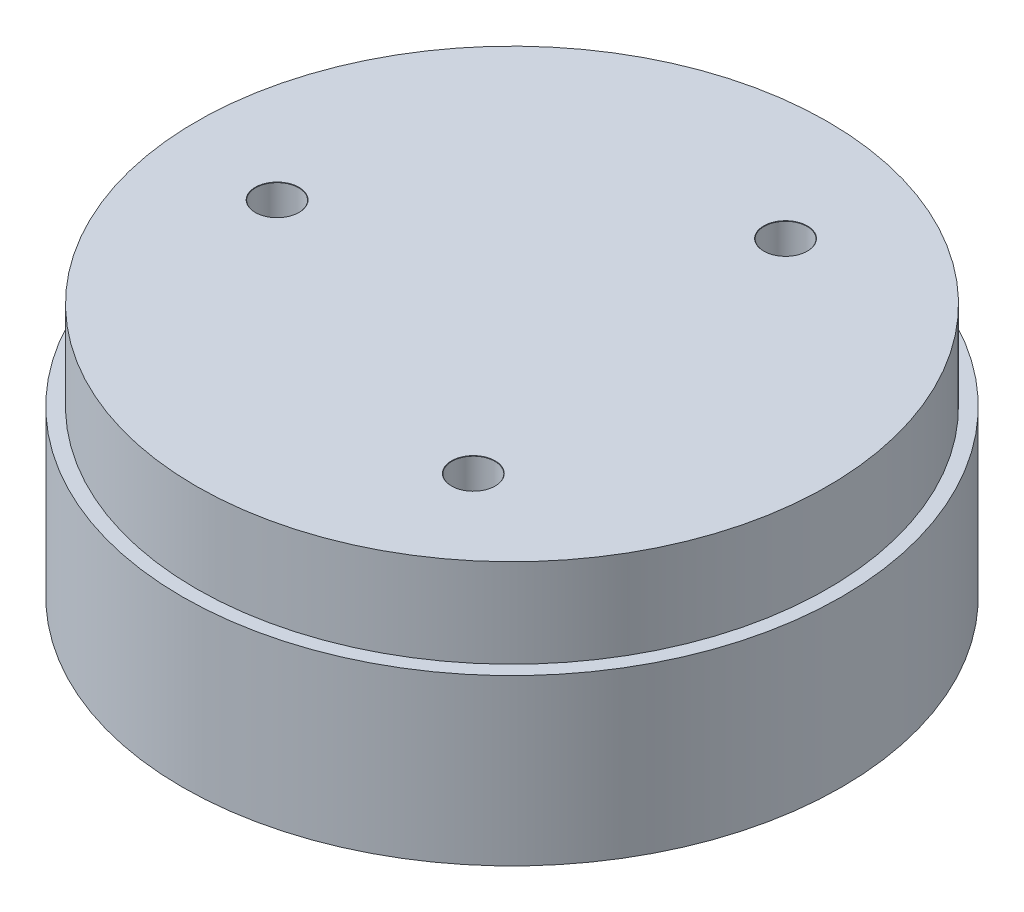
ISO-10303-21;
HEADER;
FILE_DESCRIPTION(('STEP AP214'),'2;1');
FILE_NAME('part.step','',(''),(''),'','','');
FILE_SCHEMA(('AUTOMOTIVE_DESIGN { 1 0 10303 214 1 1 1 1 }'));
ENDSEC;
DATA;
#1=APPLICATION_CONTEXT('core data for automotive mechanical design processes');
#2=APPLICATION_PROTOCOL_DEFINITION('international standard','automotive_design',2000,#1);
#3=PRODUCT_CONTEXT('',#1,'mechanical');
#4=PRODUCT('Part','Part','',(#3));
#5=PRODUCT_RELATED_PRODUCT_CATEGORY('part','',(#4));
#6=PRODUCT_DEFINITION_FORMATION('','',#4);
#7=PRODUCT_DEFINITION_CONTEXT('part definition',#1,'design');
#8=PRODUCT_DEFINITION('design','',#6,#7);
#9=PRODUCT_DEFINITION_SHAPE('','',#8);
#10=(LENGTH_UNIT() NAMED_UNIT(*) SI_UNIT(.MILLI.,.METRE.));
#11=(NAMED_UNIT(*) PLANE_ANGLE_UNIT() SI_UNIT($,.RADIAN.));
#12=(NAMED_UNIT(*) SI_UNIT($,.STERADIAN.) SOLID_ANGLE_UNIT());
#13=UNCERTAINTY_MEASURE_WITH_UNIT(LENGTH_MEASURE(1.E-05),#10,'distance_accuracy_value','');
#14=(GEOMETRIC_REPRESENTATION_CONTEXT(3) GLOBAL_UNCERTAINTY_ASSIGNED_CONTEXT((#13)) GLOBAL_UNIT_ASSIGNED_CONTEXT((#10,
#11,#12)) REPRESENTATION_CONTEXT('',''));
#15=CARTESIAN_POINT('',(0.,0.,0.));
#16=DIRECTION('',(0.,0.,1.));
#17=DIRECTION('',(1.,0.,0.));
#18=AXIS2_PLACEMENT_3D('',#15,#16,#17);
#19=CARTESIAN_POINT('',(0.,13.,0.));
#20=DIRECTION('',(0.,-1.,0.));
#21=DIRECTION('',(0.,0.,-1.));
#22=AXIS2_PLACEMENT_3D('',#19,#20,#21);
#23=CYLINDRICAL_SURFACE('',#22,26.);
#24=CARTESIAN_POINT('',(0.,13.,0.));
#25=DIRECTION('',(0.,1.,0.));
#26=DIRECTION('',(0.,0.,1.));
#27=AXIS2_PLACEMENT_3D('',#24,#25,#26);
#28=CIRCLE('',#27,26.);
#29=CARTESIAN_POINT('',(0.,13.,-26.));
#30=VERTEX_POINT('',#29);
#31=EDGE_CURVE('E43',#30,#30,#28,.T.);
#32=CARTESIAN_POINT('',(0.,0.,0.));
#33=DIRECTION('',(0.,1.,0.));
#34=DIRECTION('',(0.,0.,1.));
#35=AXIS2_PLACEMENT_3D('',#32,#33,#34);
#36=CIRCLE('',#35,26.);
#37=CARTESIAN_POINT('',(0.,0.,-26.));
#38=VERTEX_POINT('',#37);
#39=EDGE_CURVE('E39',#38,#38,#36,.T.);
#40=CARTESIAN_POINT('',(0.,13.,-26.));
#41=CARTESIAN_POINT('',(0.,12.8645833333333,-26.));
#42=CARTESIAN_POINT('',(0.,12.7291666666667,-26.));
#43=CARTESIAN_POINT('',(0.,12.4583333333333,-26.));
#44=CARTESIAN_POINT('',(0.,12.3229166666667,-26.));
#45=CARTESIAN_POINT('',(0.,12.0520833333333,-26.));
#46=CARTESIAN_POINT('',(0.,11.9166666666667,-26.));
#47=CARTESIAN_POINT('',(0.,11.6458333333333,-26.));
#48=CARTESIAN_POINT('',(0.,11.5104166666667,-26.));
#49=CARTESIAN_POINT('',(0.,11.2395833333333,-26.));
#50=CARTESIAN_POINT('',(0.,11.1041666666667,-26.));
#51=CARTESIAN_POINT('',(0.,10.8333333333333,-26.));
#52=CARTESIAN_POINT('',(0.,10.6979166666667,-26.));
#53=CARTESIAN_POINT('',(0.,10.4270833333333,-26.));
#54=CARTESIAN_POINT('',(0.,10.2916666666667,-26.));
#55=CARTESIAN_POINT('',(0.,10.0208333333333,-26.));
#56=CARTESIAN_POINT('',(0.,9.88541666666667,-26.));
#57=CARTESIAN_POINT('',(0.,9.61458333333333,-26.));
#58=CARTESIAN_POINT('',(0.,9.47916666666667,-26.));
#59=CARTESIAN_POINT('',(0.,9.20833333333333,-26.));
#60=CARTESIAN_POINT('',(0.,9.07291666666666,-26.));
#61=CARTESIAN_POINT('',(0.,8.80208333333333,-26.));
#62=CARTESIAN_POINT('',(0.,8.66666666666667,-26.));
#63=CARTESIAN_POINT('',(0.,8.39583333333333,-26.));
#64=CARTESIAN_POINT('',(0.,8.26041666666667,-26.));
#65=CARTESIAN_POINT('',(0.,7.98958333333333,-26.));
#66=CARTESIAN_POINT('',(0.,7.85416666666667,-26.));
#67=CARTESIAN_POINT('',(0.,7.58333333333333,-26.));
#68=CARTESIAN_POINT('',(0.,7.44791666666667,-26.));
#69=CARTESIAN_POINT('',(0.,7.17708333333333,-26.));
#70=CARTESIAN_POINT('',(0.,7.04166666666667,-26.));
#71=CARTESIAN_POINT('',(0.,6.77083333333333,-26.));
#72=CARTESIAN_POINT('',(0.,6.63541666666667,-26.));
#73=CARTESIAN_POINT('',(0.,6.36458333333333,-26.));
#74=CARTESIAN_POINT('',(0.,6.22916666666667,-26.));
#75=CARTESIAN_POINT('',(0.,5.95833333333333,-26.));
#76=CARTESIAN_POINT('',(0.,5.82291666666667,-26.));
#77=CARTESIAN_POINT('',(0.,5.55208333333333,-26.));
#78=CARTESIAN_POINT('',(0.,5.41666666666667,-26.));
#79=CARTESIAN_POINT('',(0.,5.14583333333333,-26.));
#80=CARTESIAN_POINT('',(0.,5.01041666666667,-26.));
#81=CARTESIAN_POINT('',(0.,4.73958333333333,-26.));
#82=CARTESIAN_POINT('',(0.,4.60416666666667,-26.));
#83=CARTESIAN_POINT('',(0.,4.33333333333333,-26.));
#84=CARTESIAN_POINT('',(0.,4.19791666666667,-26.));
#85=CARTESIAN_POINT('',(0.,3.92708333333333,-26.));
#86=CARTESIAN_POINT('',(0.,3.79166666666667,-26.));
#87=CARTESIAN_POINT('',(0.,3.52083333333333,-26.));
#88=CARTESIAN_POINT('',(0.,3.38541666666667,-26.));
#89=CARTESIAN_POINT('',(0.,3.11458333333333,-26.));
#90=CARTESIAN_POINT('',(0.,2.97916666666667,-26.));
#91=CARTESIAN_POINT('',(0.,2.70833333333333,-26.));
#92=CARTESIAN_POINT('',(0.,2.57291666666667,-26.));
#93=CARTESIAN_POINT('',(0.,2.30208333333333,-26.));
#94=CARTESIAN_POINT('',(0.,2.16666666666667,-26.));
#95=CARTESIAN_POINT('',(0.,1.89583333333333,-26.));
#96=CARTESIAN_POINT('',(0.,1.76041666666667,-26.));
#97=CARTESIAN_POINT('',(0.,1.48958333333333,-26.));
#98=CARTESIAN_POINT('',(0.,1.35416666666667,-26.));
#99=CARTESIAN_POINT('',(0.,1.08333333333333,-26.));
#100=CARTESIAN_POINT('',(0.,0.947916666666667,-26.));
#101=CARTESIAN_POINT('',(0.,0.677083333333334,-26.));
#102=CARTESIAN_POINT('',(0.,0.541666666666667,-26.));
#103=CARTESIAN_POINT('',(0.,0.270833333333334,-26.));
#104=CARTESIAN_POINT('',(0.,0.135416666666667,-26.));
#105=CARTESIAN_POINT('',(0.,0.,-26.));
#106=B_SPLINE_CURVE_WITH_KNOTS('',3,(#40,#41,#42,#43,#44,#45,#46,#47,#48,#49,#50,#51,#52,#53,
#54,#55,#56,#57,#58,#59,#60,#61,#62,#63,#64,#65,#66,#67,#68,#69,#70,#71,#72,#73,#74,#75,#76,#77,
#78,#79,#80,#81,#82,#83,#84,#85,#86,#87,#88,#89,#90,#91,#92,#93,#94,#95,#96,#97,#98,#99,#100,
#101,#102,#103,#104,#105),.UNSPECIFIED.,.F.,.F.,(4,2,2,2,2,2,2,2,2,2,2,2,2,2,2,2,2,2,2,2,2,2,2,
2,2,2,2,2,2,2,2,2,4),(0.,0.40625,0.812500000000001,1.21875,1.625,2.03125,2.4375,2.84375,3.25,
3.65625,4.0625,4.46875,4.875,5.28125,5.6875,6.09375,6.5,6.90625,7.3125,7.71875,8.125,8.53125,
8.9375,9.34375,9.75,10.15625,10.5625,10.96875,11.375,11.78125,12.1875,12.59375,13.),.UNSPECIFIED.);
#107=EDGE_CURVE('BSEAM36',#30,#38,#106,.T.);
#108=ORIENTED_EDGE('',*,*,#31,.F.);
#109=ORIENTED_EDGE('',*,*,#39,.T.);
#110=ORIENTED_EDGE('',*,*,#107,.T.);
#111=ORIENTED_EDGE('',*,*,#107,.F.);
#112=EDGE_LOOP('',(#108,#110,#109,#111));
#113=FACE_BOUND('',#112,.T.);
#114=ADVANCED_FACE('F36',(#113),#23,.T.);
#115=CARTESIAN_POINT('',(0.,13.,0.));
#116=DIRECTION('',(0.,1.,0.));
#117=DIRECTION('',(0.,0.,1.));
#118=AXIS2_PLACEMENT_3D('',#115,#116,#117);
#119=PLANE('',#118);
#120=CARTESIAN_POINT('',(0.,13.,0.));
#121=DIRECTION('',(0.,1.,0.));
#122=DIRECTION('',(0.,0.,1.));
#123=AXIS2_PLACEMENT_3D('',#120,#121,#122);
#124=CIRCLE('',#123,24.9);
#125=CARTESIAN_POINT('',(0.,13.,24.9));
#126=VERTEX_POINT('',#125);
#127=EDGE_CURVE('E10',#126,#126,#124,.T.);
#128=ORIENTED_EDGE('',*,*,#127,.F.);
#129=EDGE_LOOP('',(#128));
#130=FACE_BOUND('',#129,.T.);
#131=ORIENTED_EDGE('',*,*,#31,.T.);
#132=EDGE_LOOP('',(#131));
#133=FACE_BOUND('',#132,.T.);
#134=ADVANCED_FACE('F101',(#130,#133),#119,.T.);
#135=CARTESIAN_POINT('',(0.,0.,0.));
#136=DIRECTION('',(0.,1.,0.));
#137=DIRECTION('',(0.,0.,1.));
#138=AXIS2_PLACEMENT_3D('',#135,#136,#137);
#139=PLANE('',#138);
#140=CARTESIAN_POINT('',(10.050651192934,0.,13.0982636482083));
#141=DIRECTION('',(0.,1.,0.));
#142=DIRECTION('',(0.,0.,1.));
#143=AXIS2_PLACEMENT_3D('',#140,#141,#142);
#144=CIRCLE('',#143,1.69999999999999);
#145=CARTESIAN_POINT('',(10.050651192934,0.,14.7982636482083));
#146=VERTEX_POINT('',#145);
#147=EDGE_CURVE('E70',#146,#146,#144,.T.);
#148=ORIENTED_EDGE('',*,*,#147,.T.);
#149=EDGE_LOOP('',(#148));
#150=FACE_BOUND('',#149,.T.);
#151=CARTESIAN_POINT('',(-16.3687546612816,0.,2.15498743355312));
#152=DIRECTION('',(0.,1.,0.));
#153=DIRECTION('',(0.,0.,1.));
#154=AXIS2_PLACEMENT_3D('',#151,#152,#153);
#155=CIRCLE('',#154,1.69999999999999);
#156=CARTESIAN_POINT('',(-16.3687546612816,0.,3.85498743355312));
#157=VERTEX_POINT('',#156);
#158=EDGE_CURVE('E61',#157,#157,#155,.T.);
#159=ORIENTED_EDGE('',*,*,#158,.T.);
#160=EDGE_LOOP('',(#159));
#161=FACE_BOUND('',#160,.T.);
#162=CARTESIAN_POINT('',(6.31810346834754,0.,-15.2532510817614));
#163=DIRECTION('',(0.,1.,0.));
#164=DIRECTION('',(0.,0.,1.));
#165=AXIS2_PLACEMENT_3D('',#162,#163,#164);
#166=CIRCLE('',#165,1.69999999999999);
#167=CARTESIAN_POINT('',(6.31810346834754,0.,-13.5532510817614));
#168=VERTEX_POINT('',#167);
#169=EDGE_CURVE('E52',#168,#168,#166,.T.);
#170=ORIENTED_EDGE('',*,*,#169,.T.);
#171=EDGE_LOOP('',(#170));
#172=FACE_BOUND('',#171,.T.);
#173=ORIENTED_EDGE('',*,*,#39,.F.);
#174=EDGE_LOOP('',(#173));
#175=FACE_BOUND('',#174,.T.);
#176=ADVANCED_FACE('F95',(#150,#161,#172,#175),#139,.F.);
#177=CARTESIAN_POINT('',(0.,20.,0.));
#178=DIRECTION('',(0.,-1.,0.));
#179=DIRECTION('',(0.,0.,-1.));
#180=AXIS2_PLACEMENT_3D('',#177,#178,#179);
#181=CYLINDRICAL_SURFACE('',#180,24.9);
#182=CARTESIAN_POINT('',(0.,20.,0.));
#183=DIRECTION('',(0.,1.,0.));
#184=DIRECTION('',(0.,0.,1.));
#185=AXIS2_PLACEMENT_3D('',#182,#183,#184);
#186=CIRCLE('',#185,24.9);
#187=CARTESIAN_POINT('',(0.,20.,24.9));
#188=VERTEX_POINT('',#187);
#189=EDGE_CURVE('E49',#188,#188,#186,.T.);
#190=ORIENTED_EDGE('',*,*,#189,.F.);
#191=EDGE_LOOP('',(#190));
#192=FACE_BOUND('',#191,.T.);
#193=ORIENTED_EDGE('',*,*,#127,.T.);
#194=EDGE_LOOP('',(#193));
#195=FACE_BOUND('',#194,.T.);
#196=ADVANCED_FACE('F86',(#192,#195),#181,.T.);
#197=CARTESIAN_POINT('',(0.,20.,0.));
#198=DIRECTION('',(0.,1.,0.));
#199=DIRECTION('',(0.,0.,1.));
#200=AXIS2_PLACEMENT_3D('',#197,#198,#199);
#201=PLANE('',#200);
#202=CARTESIAN_POINT('',(10.050651192934,20.,13.0982636482083));
#203=DIRECTION('',(0.,1.,0.));
#204=DIRECTION('',(0.,0.,1.));
#205=AXIS2_PLACEMENT_3D('',#202,#203,#204);
#206=CIRCLE('',#205,1.725);
#207=CARTESIAN_POINT('',(10.050651192934,20.,14.8232636482083));
#208=VERTEX_POINT('',#207);
#209=EDGE_CURVE('E76',#208,#208,#206,.T.);
#210=ORIENTED_EDGE('',*,*,#209,.F.);
#211=EDGE_LOOP('',(#210));
#212=FACE_BOUND('',#211,.T.);
#213=CARTESIAN_POINT('',(-16.3687546612816,20.,2.15498743355312));
#214=DIRECTION('',(0.,1.,0.));
#215=DIRECTION('',(0.,0.,1.));
#216=AXIS2_PLACEMENT_3D('',#213,#214,#215);
#217=CIRCLE('',#216,1.725);
#218=CARTESIAN_POINT('',(-16.3687546612816,20.,3.87998743355312));
#219=VERTEX_POINT('',#218);
#220=EDGE_CURVE('E67',#219,#219,#217,.T.);
#221=ORIENTED_EDGE('',*,*,#220,.F.);
#222=EDGE_LOOP('',(#221));
#223=FACE_BOUND('',#222,.T.);
#224=CARTESIAN_POINT('',(6.31810346834754,20.,-15.2532510817614));
#225=DIRECTION('',(0.,1.,0.));
#226=DIRECTION('',(0.,0.,1.));
#227=AXIS2_PLACEMENT_3D('',#224,#225,#226);
#228=CIRCLE('',#227,1.725);
#229=CARTESIAN_POINT('',(6.31810346834754,20.,-13.5282510817614));
#230=VERTEX_POINT('',#229);
#231=EDGE_CURVE('E58',#230,#230,#228,.T.);
#232=ORIENTED_EDGE('',*,*,#231,.F.);
#233=EDGE_LOOP('',(#232));
#234=FACE_BOUND('',#233,.T.);
#235=ORIENTED_EDGE('',*,*,#189,.T.);
#236=EDGE_LOOP('',(#235));
#237=FACE_BOUND('',#236,.T.);
#238=ADVANCED_FACE('F82',(#212,#223,#234,#237),#201,.T.);
#239=CARTESIAN_POINT('',(6.31810346834754,20.,-15.2532510817614));
#240=DIRECTION('',(0.,1.,0.));
#241=DIRECTION('',(0.,0.,1.));
#242=AXIS2_PLACEMENT_3D('',#239,#240,#241);
#243=CYLINDRICAL_SURFACE('',#242,1.7);
#244=ORIENTED_EDGE('',*,*,#169,.F.);
#245=EDGE_LOOP('',(#244));
#246=FACE_BOUND('',#245,.T.);
#247=CARTESIAN_POINT('',(6.31810346834754,19.975,-15.2532510817614));
#248=DIRECTION('',(0.,1.,0.));
#249=DIRECTION('',(0.,0.,1.));
#250=AXIS2_PLACEMENT_3D('',#247,#248,#249);
#251=CIRCLE('',#250,1.7);
#252=CARTESIAN_POINT('',(6.31810346834754,19.975,-13.5532510817614));
#253=VERTEX_POINT('',#252);
#254=EDGE_CURVE('E55',#253,#253,#251,.T.);
#255=ORIENTED_EDGE('',*,*,#254,.T.);
#256=EDGE_LOOP('',(#255));
#257=FACE_BOUND('',#256,.T.);
#258=ADVANCED_FACE('F85',(#246,#257),#243,.F.);
#259=CARTESIAN_POINT('',(6.31810346834754,20.,-15.2532510817614));
#260=DIRECTION('',(0.,1.,0.));
#261=DIRECTION('',(0.,0.,1.));
#262=AXIS2_PLACEMENT_3D('',#259,#260,#261);
#263=CONICAL_SURFACE('',#262,1.725,0.785398163397414);
#264=ORIENTED_EDGE('',*,*,#254,.F.);
#265=EDGE_LOOP('',(#264));
#266=FACE_BOUND('',#265,.T.);
#267=ORIENTED_EDGE('',*,*,#231,.T.);
#268=EDGE_LOOP('',(#267));
#269=FACE_BOUND('',#268,.T.);
#270=ADVANCED_FACE('F146',(#266,#269),#263,.F.);
#271=CARTESIAN_POINT('',(-16.3687546612816,20.,2.15498743355312));
#272=DIRECTION('',(0.,1.,0.));
#273=DIRECTION('',(0.,0.,1.));
#274=AXIS2_PLACEMENT_3D('',#271,#272,#273);
#275=CYLINDRICAL_SURFACE('',#274,1.7);
#276=ORIENTED_EDGE('',*,*,#158,.F.);
#277=EDGE_LOOP('',(#276));
#278=FACE_BOUND('',#277,.T.);
#279=CARTESIAN_POINT('',(-16.3687546612816,19.975,2.15498743355312));
#280=DIRECTION('',(0.,1.,0.));
#281=DIRECTION('',(0.,0.,1.));
#282=AXIS2_PLACEMENT_3D('',#279,#280,#281);
#283=CIRCLE('',#282,1.7);
#284=CARTESIAN_POINT('',(-16.3687546612816,19.975,3.85498743355312));
#285=VERTEX_POINT('',#284);
#286=EDGE_CURVE('E64',#285,#285,#283,.T.);
#287=ORIENTED_EDGE('',*,*,#286,.T.);
#288=EDGE_LOOP('',(#287));
#289=FACE_BOUND('',#288,.T.);
#290=ADVANCED_FACE('F156',(#278,#289),#275,.F.);
#291=CARTESIAN_POINT('',(-16.3687546612816,20.,2.15498743355312));
#292=DIRECTION('',(0.,1.,0.));
#293=DIRECTION('',(0.,0.,1.));
#294=AXIS2_PLACEMENT_3D('',#291,#292,#293);
#295=CONICAL_SURFACE('',#294,1.725,0.785398163397448);
#296=ORIENTED_EDGE('',*,*,#286,.F.);
#297=EDGE_LOOP('',(#296));
#298=FACE_BOUND('',#297,.T.);
#299=ORIENTED_EDGE('',*,*,#220,.T.);
#300=EDGE_LOOP('',(#299));
#301=FACE_BOUND('',#300,.T.);
#302=ADVANCED_FACE('F166',(#298,#301),#295,.F.);
#303=CARTESIAN_POINT('',(10.050651192934,20.,13.0982636482083));
#304=DIRECTION('',(0.,1.,0.));
#305=DIRECTION('',(0.,0.,1.));
#306=AXIS2_PLACEMENT_3D('',#303,#304,#305);
#307=CYLINDRICAL_SURFACE('',#306,1.7);
#308=ORIENTED_EDGE('',*,*,#147,.F.);
#309=EDGE_LOOP('',(#308));
#310=FACE_BOUND('',#309,.T.);
#311=CARTESIAN_POINT('',(10.050651192934,19.975,13.0982636482083));
#312=DIRECTION('',(0.,1.,0.));
#313=DIRECTION('',(0.,0.,1.));
#314=AXIS2_PLACEMENT_3D('',#311,#312,#313);
#315=CIRCLE('',#314,1.7);
#316=CARTESIAN_POINT('',(10.050651192934,19.975,14.7982636482083));
#317=VERTEX_POINT('',#316);
#318=EDGE_CURVE('E73',#317,#317,#315,.T.);
#319=ORIENTED_EDGE('',*,*,#318,.T.);
#320=EDGE_LOOP('',(#319));
#321=FACE_BOUND('',#320,.T.);
#322=ADVANCED_FACE('F176',(#310,#321),#307,.F.);
#323=CARTESIAN_POINT('',(10.050651192934,20.,13.0982636482083));
#324=DIRECTION('',(0.,1.,0.));
#325=DIRECTION('',(0.,0.,1.));
#326=AXIS2_PLACEMENT_3D('',#323,#324,#325);
#327=CONICAL_SURFACE('',#326,1.725,0.785398163397414);
#328=ORIENTED_EDGE('',*,*,#318,.F.);
#329=EDGE_LOOP('',(#328));
#330=FACE_BOUND('',#329,.T.);
#331=ORIENTED_EDGE('',*,*,#209,.T.);
#332=EDGE_LOOP('',(#331));
#333=FACE_BOUND('',#332,.T.);
#334=ADVANCED_FACE('F80',(#330,#333),#327,.F.);
#335=CLOSED_SHELL('',(#114,#134,#176,#196,#238,#258,#270,#290,#302,#322,#334));
#336=MANIFOLD_SOLID_BREP('B2',#335);
#337=ADVANCED_BREP_SHAPE_REPRESENTATION('',(#18,#336),#14);
#338=SHAPE_DEFINITION_REPRESENTATION(#9,#337);
ENDSEC;
END-ISO-10303-21;
